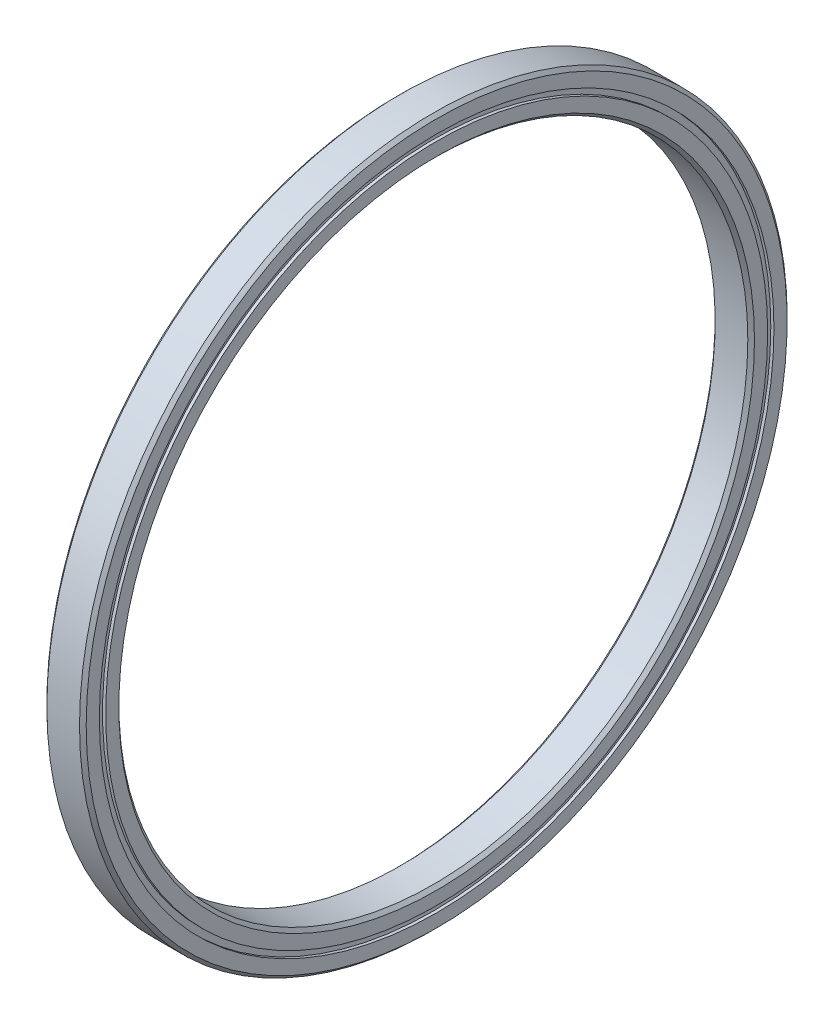
ISO-10303-21;
HEADER;
FILE_DESCRIPTION(('STEP AP214'),'2;1');
FILE_NAME('part.step','',(''),(''),'','','');
FILE_SCHEMA(('AUTOMOTIVE_DESIGN { 1 0 10303 214 1 1 1 1 }'));
ENDSEC;
DATA;
#1=APPLICATION_CONTEXT('core data for automotive mechanical design processes');
#2=APPLICATION_PROTOCOL_DEFINITION('international standard','automotive_design',2000,#1);
#3=PRODUCT_CONTEXT('',#1,'mechanical');
#4=PRODUCT('Part','Part','',(#3));
#5=PRODUCT_RELATED_PRODUCT_CATEGORY('part','',(#4));
#6=PRODUCT_DEFINITION_FORMATION('','',#4);
#7=PRODUCT_DEFINITION_CONTEXT('part definition',#1,'design');
#8=PRODUCT_DEFINITION('design','',#6,#7);
#9=PRODUCT_DEFINITION_SHAPE('','',#8);
#10=(LENGTH_UNIT() NAMED_UNIT(*) SI_UNIT(.MILLI.,.METRE.));
#11=(NAMED_UNIT(*) PLANE_ANGLE_UNIT() SI_UNIT($,.RADIAN.));
#12=(NAMED_UNIT(*) SI_UNIT($,.STERADIAN.) SOLID_ANGLE_UNIT());
#13=UNCERTAINTY_MEASURE_WITH_UNIT(LENGTH_MEASURE(1.E-05),#10,'distance_accuracy_value','');
#14=(GEOMETRIC_REPRESENTATION_CONTEXT(3) GLOBAL_UNCERTAINTY_ASSIGNED_CONTEXT((#13)) GLOBAL_UNIT_ASSIGNED_CONTEXT((#10,
#11,#12)) REPRESENTATION_CONTEXT('',''));
#15=CARTESIAN_POINT('',(0.,0.,0.));
#16=DIRECTION('',(0.,0.,1.));
#17=DIRECTION('',(1.,0.,0.));
#18=AXIS2_PLACEMENT_3D('',#15,#16,#17);
#19=CARTESIAN_POINT('',(-1.31809231637,-53.975,0.));
#20=DIRECTION('',(1.,0.,0.));
#21=DIRECTION('',(0.,0.,-1.));
#22=AXIS2_PLACEMENT_3D('',#19,#20,#21);
#23=CYLINDRICAL_SURFACE('',#22,50.8);
#24=CARTESIAN_POINT('',(-2.63618463276569,-53.975,0.));
#25=DIRECTION('',(-1.,0.,0.));
#26=DIRECTION('',(0.,1.,0.));
#27=AXIS2_PLACEMENT_3D('',#24,#25,#26);
#28=CIRCLE('',#27,50.7999999999943);
#29=CARTESIAN_POINT('',(-2.63618463276569,-3.17500000000569,0.));
#30=VERTEX_POINT('',#29);
#31=EDGE_CURVE('E30',#30,#30,#28,.T.);
#32=ORIENTED_EDGE('',*,*,#31,.T.);
#33=EDGE_LOOP('',(#32));
#34=FACE_BOUND('',#33,.T.);
#35=CARTESIAN_POINT('',(2.6361846327557,-53.975,0.));
#36=DIRECTION('',(1.,0.,0.));
#37=DIRECTION('',(0.,1.,0.));
#38=AXIS2_PLACEMENT_3D('',#35,#36,#37);
#39=CIRCLE('',#38,50.7999999999843);
#40=CARTESIAN_POINT('',(2.63618463275569,-3.17500000001569,0.));
#41=VERTEX_POINT('',#40);
#42=EDGE_CURVE('E33',#41,#41,#39,.T.);
#43=ORIENTED_EDGE('',*,*,#42,.T.);
#44=EDGE_LOOP('',(#43));
#45=FACE_BOUND('',#44,.T.);
#46=ADVANCED_FACE('F15',(#34,#45),#23,.F.);
#47=CARTESIAN_POINT('',(3.17499999938431,-53.975,0.));
#48=DIRECTION('',(1.,0.,0.));
#49=DIRECTION('',(0.,0.,-1.));
#50=AXIS2_PLACEMENT_3D('',#47,#48,#49);
#51=CONICAL_SURFACE('',#50,51.3388153666157,0.785398163399999);
#52=ORIENTED_EDGE('',*,*,#42,.F.);
#53=EDGE_LOOP('',(#52));
#54=FACE_BOUND('',#53,.T.);
#55=CARTESIAN_POINT('',(3.17499999938431,-53.975,0.));
#56=DIRECTION('',(1.,0.,0.));
#57=DIRECTION('',(0.,0.,-1.));
#58=AXIS2_PLACEMENT_3D('',#55,#56,#57);
#59=CIRCLE('',#58,51.3388153666157);
#60=CARTESIAN_POINT('',(3.17499999938431,-53.975,-51.3388153666157));
#61=VERTEX_POINT('',#60);
#62=EDGE_CURVE('E18',#61,#61,#59,.F.);
#63=ORIENTED_EDGE('',*,*,#62,.F.);
#64=EDGE_LOOP('',(#63));
#65=FACE_BOUND('',#64,.T.);
#66=ADVANCED_FACE('F74',(#54,#65),#51,.F.);
#67=CARTESIAN_POINT('',(-3.17499999988432,-53.975,0.));
#68=DIRECTION('',(-1.,0.,0.));
#69=DIRECTION('',(0.,0.,1.));
#70=AXIS2_PLACEMENT_3D('',#67,#68,#69);
#71=CONICAL_SURFACE('',#70,51.3388153671157,0.785398163399999);
#72=CARTESIAN_POINT('',(-3.17499999988433,-53.975,0.));
#73=DIRECTION('',(-1.,0.,0.));
#74=DIRECTION('',(0.,0.,1.));
#75=AXIS2_PLACEMENT_3D('',#72,#73,#74);
#76=CIRCLE('',#75,51.3388153671157);
#77=CARTESIAN_POINT('',(-3.17499999988433,-53.975,51.3388153671157));
#78=VERTEX_POINT('',#77);
#79=EDGE_CURVE('E64',#78,#78,#76,.F.);
#80=ORIENTED_EDGE('',*,*,#79,.F.);
#81=EDGE_LOOP('',(#80));
#82=FACE_BOUND('',#81,.T.);
#83=ORIENTED_EDGE('',*,*,#31,.F.);
#84=EDGE_LOOP('',(#83));
#85=FACE_BOUND('',#84,.T.);
#86=ADVANCED_FACE('F76',(#82,#85),#71,.F.);
#87=CARTESIAN_POINT('',(3.175,-2.63618463274,0.));
#88=DIRECTION('',(1.,0.,0.));
#89=DIRECTION('',(0.,0.,-1.));
#90=AXIS2_PLACEMENT_3D('',#87,#88,#89);
#91=PLANE('',#90);
#92=ORIENTED_EDGE('',*,*,#62,.T.);
#93=EDGE_LOOP('',(#92));
#94=FACE_BOUND('',#93,.T.);
#95=CARTESIAN_POINT('',(3.17500000066,-53.975,0.));
#96=DIRECTION('',(1.,0.,0.));
#97=DIRECTION('',(0.,0.,-1.));
#98=AXIS2_PLACEMENT_3D('',#95,#96,#97);
#99=CIRCLE('',#98,53.467);
#100=CARTESIAN_POINT('',(3.17500000066,-53.975,-53.467));
#101=VERTEX_POINT('',#100);
#102=EDGE_CURVE('E62',#101,#101,#99,.F.);
#103=ORIENTED_EDGE('',*,*,#102,.F.);
#104=EDGE_LOOP('',(#103));
#105=FACE_BOUND('',#104,.T.);
#106=ADVANCED_FACE('F71',(#94,#105),#91,.T.);
#107=CARTESIAN_POINT('',(-3.175,-0.508,0.));
#108=DIRECTION('',(-1.,0.,0.));
#109=DIRECTION('',(0.,0.,1.));
#110=AXIS2_PLACEMENT_3D('',#107,#108,#109);
#111=PLANE('',#110);
#112=ORIENTED_EDGE('',*,*,#79,.T.);
#113=EDGE_LOOP('',(#112));
#114=FACE_BOUND('',#113,.T.);
#115=CARTESIAN_POINT('',(-3.175,-53.975,0.));
#116=DIRECTION('',(1.,0.,0.));
#117=DIRECTION('',(0.,0.,-1.));
#118=AXIS2_PLACEMENT_3D('',#115,#116,#117);
#119=CIRCLE('',#118,53.467);
#120=CARTESIAN_POINT('',(-3.175,-53.975,-53.467));
#121=VERTEX_POINT('',#120);
#122=EDGE_CURVE('E59',#121,#121,#119,.T.);
#123=ORIENTED_EDGE('',*,*,#122,.F.);
#124=EDGE_LOOP('',(#123));
#125=FACE_BOUND('',#124,.T.);
#126=ADVANCED_FACE('F133',(#114,#125),#111,.T.);
#127=CARTESIAN_POINT('',(2.921,-53.975,0.));
#128=DIRECTION('',(1.,0.,0.));
#129=DIRECTION('',(0.,0.,-1.));
#130=AXIS2_PLACEMENT_3D('',#127,#128,#129);
#131=CYLINDRICAL_SURFACE('',#130,53.467);
#132=ORIENTED_EDGE('',*,*,#102,.T.);
#133=EDGE_LOOP('',(#132));
#134=FACE_BOUND('',#133,.T.);
#135=CARTESIAN_POINT('',(2.66699999934,-53.975,0.));
#136=DIRECTION('',(1.,0.,0.));
#137=DIRECTION('',(0.,0.,-1.));
#138=AXIS2_PLACEMENT_3D('',#135,#136,#137);
#139=CIRCLE('',#138,53.467);
#140=CARTESIAN_POINT('',(2.66699999934,-53.975,-53.467));
#141=VERTEX_POINT('',#140);
#142=EDGE_CURVE('E56',#141,#141,#139,.F.);
#143=ORIENTED_EDGE('',*,*,#142,.F.);
#144=EDGE_LOOP('',(#143));
#145=FACE_BOUND('',#144,.T.);
#146=ADVANCED_FACE('F129',(#134,#145),#131,.T.);
#147=CARTESIAN_POINT('',(-2.921,-53.975,0.));
#148=DIRECTION('',(1.,0.,0.));
#149=DIRECTION('',(0.,0.,-1.));
#150=AXIS2_PLACEMENT_3D('',#147,#148,#149);
#151=CYLINDRICAL_SURFACE('',#150,53.467);
#152=CARTESIAN_POINT('',(-2.66699999934,-53.975,0.));
#153=DIRECTION('',(1.,0.,0.));
#154=DIRECTION('',(0.,0.,-1.));
#155=AXIS2_PLACEMENT_3D('',#152,#153,#154);
#156=CIRCLE('',#155,53.467);
#157=CARTESIAN_POINT('',(-2.66699999934,-53.975,-53.467));
#158=VERTEX_POINT('',#157);
#159=EDGE_CURVE('E53',#158,#158,#156,.T.);
#160=ORIENTED_EDGE('',*,*,#159,.F.);
#161=EDGE_LOOP('',(#160));
#162=FACE_BOUND('',#161,.T.);
#163=ORIENTED_EDGE('',*,*,#122,.T.);
#164=EDGE_LOOP('',(#163));
#165=FACE_BOUND('',#164,.T.);
#166=ADVANCED_FACE('F125',(#162,#165),#151,.T.);
#167=CARTESIAN_POINT('',(2.667,0.,0.));
#168=DIRECTION('',(1.,0.,0.));
#169=DIRECTION('',(0.,0.,-1.));
#170=AXIS2_PLACEMENT_3D('',#167,#168,#169);
#171=PLANE('',#170);
#172=ORIENTED_EDGE('',*,*,#142,.T.);
#173=EDGE_LOOP('',(#172));
#174=FACE_BOUND('',#173,.T.);
#175=CARTESIAN_POINT('',(2.66699999934,-53.975,0.));
#176=DIRECTION('',(1.,0.,0.));
#177=DIRECTION('',(0.,0.,-1.));
#178=AXIS2_PLACEMENT_3D('',#175,#176,#177);
#179=CIRCLE('',#178,54.483);
#180=CARTESIAN_POINT('',(2.66699999934,-53.975,-54.483));
#181=VERTEX_POINT('',#180);
#182=EDGE_CURVE('E50',#181,#181,#179,.T.);
#183=ORIENTED_EDGE('',*,*,#182,.T.);
#184=EDGE_LOOP('',(#183));
#185=FACE_BOUND('',#184,.T.);
#186=ADVANCED_FACE('F121',(#174,#185),#171,.T.);
#187=CARTESIAN_POINT('',(-2.667,0.508,0.));
#188=DIRECTION('',(-1.,0.,0.));
#189=DIRECTION('',(0.,0.,1.));
#190=AXIS2_PLACEMENT_3D('',#187,#188,#189);
#191=PLANE('',#190);
#192=ORIENTED_EDGE('',*,*,#159,.T.);
#193=EDGE_LOOP('',(#192));
#194=FACE_BOUND('',#193,.T.);
#195=CARTESIAN_POINT('',(-2.66699999934,-53.975,0.));
#196=DIRECTION('',(1.,0.,0.));
#197=DIRECTION('',(0.,0.,-1.));
#198=AXIS2_PLACEMENT_3D('',#195,#196,#197);
#199=CIRCLE('',#198,54.483);
#200=CARTESIAN_POINT('',(-2.66699999934,-53.975,-54.483));
#201=VERTEX_POINT('',#200);
#202=EDGE_CURVE('E47',#201,#201,#199,.F.);
#203=ORIENTED_EDGE('',*,*,#202,.T.);
#204=EDGE_LOOP('',(#203));
#205=FACE_BOUND('',#204,.T.);
#206=ADVANCED_FACE('F117',(#194,#205),#191,.T.);
#207=CARTESIAN_POINT('',(2.921,-53.975,0.));
#208=DIRECTION('',(1.,0.,0.));
#209=DIRECTION('',(0.,0.,-1.));
#210=AXIS2_PLACEMENT_3D('',#207,#208,#209);
#211=CYLINDRICAL_SURFACE('',#210,54.483);
#212=ORIENTED_EDGE('',*,*,#182,.F.);
#213=EDGE_LOOP('',(#212));
#214=FACE_BOUND('',#213,.T.);
#215=CARTESIAN_POINT('',(3.175,-53.975,0.));
#216=DIRECTION('',(1.,0.,0.));
#217=DIRECTION('',(0.,0.,-1.));
#218=AXIS2_PLACEMENT_3D('',#215,#216,#217);
#219=CIRCLE('',#218,54.483);
#220=CARTESIAN_POINT('',(3.175,-53.975,-54.483));
#221=VERTEX_POINT('',#220);
#222=EDGE_CURVE('E44',#221,#221,#219,.F.);
#223=ORIENTED_EDGE('',*,*,#222,.F.);
#224=EDGE_LOOP('',(#223));
#225=FACE_BOUND('',#224,.T.);
#226=ADVANCED_FACE('F113',(#214,#225),#211,.F.);
#227=CARTESIAN_POINT('',(-2.921,-53.975,0.));
#228=DIRECTION('',(1.,0.,0.));
#229=DIRECTION('',(0.,0.,-1.));
#230=AXIS2_PLACEMENT_3D('',#227,#228,#229);
#231=CYLINDRICAL_SURFACE('',#230,54.483);
#232=CARTESIAN_POINT('',(-3.17500000066,-53.975,0.));
#233=DIRECTION('',(1.,0.,0.));
#234=DIRECTION('',(0.,0.,-1.));
#235=AXIS2_PLACEMENT_3D('',#232,#233,#234);
#236=CIRCLE('',#235,54.483);
#237=CARTESIAN_POINT('',(-3.17500000066,-53.975,-54.483));
#238=VERTEX_POINT('',#237);
#239=EDGE_CURVE('E41',#238,#238,#236,.T.);
#240=ORIENTED_EDGE('',*,*,#239,.F.);
#241=EDGE_LOOP('',(#240));
#242=FACE_BOUND('',#241,.T.);
#243=ORIENTED_EDGE('',*,*,#202,.F.);
#244=EDGE_LOOP('',(#243));
#245=FACE_BOUND('',#244,.T.);
#246=ADVANCED_FACE('F109',(#242,#245),#231,.F.);
#247=CARTESIAN_POINT('',(3.175,0.508,0.));
#248=DIRECTION('',(1.,0.,0.));
#249=DIRECTION('',(0.,0.,-1.));
#250=AXIS2_PLACEMENT_3D('',#247,#248,#249);
#251=PLANE('',#250);
#252=ORIENTED_EDGE('',*,*,#222,.T.);
#253=EDGE_LOOP('',(#252));
#254=FACE_BOUND('',#253,.T.);
#255=CARTESIAN_POINT('',(3.17499999988431,-53.975,0.));
#256=DIRECTION('',(-1.,0.,0.));
#257=DIRECTION('',(0.,0.,1.));
#258=AXIS2_PLACEMENT_3D('',#255,#256,#257);
#259=CIRCLE('',#258,56.6111846328843);
#260=CARTESIAN_POINT('',(3.17499999988431,-53.975,56.6111846328843));
#261=VERTEX_POINT('',#260);
#262=EDGE_CURVE('E38',#261,#261,#259,.T.);
#263=ORIENTED_EDGE('',*,*,#262,.F.);
#264=EDGE_LOOP('',(#263));
#265=FACE_BOUND('',#264,.T.);
#266=ADVANCED_FACE('F105',(#254,#265),#251,.T.);
#267=CARTESIAN_POINT('',(-3.175,2.63618463274,0.));
#268=DIRECTION('',(-1.,0.,0.));
#269=DIRECTION('',(0.,0.,1.));
#270=AXIS2_PLACEMENT_3D('',#267,#268,#269);
#271=PLANE('',#270);
#272=ORIENTED_EDGE('',*,*,#239,.T.);
#273=EDGE_LOOP('',(#272));
#274=FACE_BOUND('',#273,.T.);
#275=CARTESIAN_POINT('',(-3.17500000001431,-53.975,0.));
#276=DIRECTION('',(1.,0.,0.));
#277=DIRECTION('',(0.,0.,-1.));
#278=AXIS2_PLACEMENT_3D('',#275,#276,#277);
#279=CIRCLE('',#278,56.6111846327543);
#280=CARTESIAN_POINT('',(-3.17500000001431,-53.975,-56.6111846327543));
#281=VERTEX_POINT('',#280);
#282=EDGE_CURVE('E27',#281,#281,#279,.T.);
#283=ORIENTED_EDGE('',*,*,#282,.F.);
#284=EDGE_LOOP('',(#283));
#285=FACE_BOUND('',#284,.T.);
#286=ADVANCED_FACE('F101',(#274,#285),#271,.T.);
#287=CARTESIAN_POINT('',(2.63618463276568,-53.975,0.));
#288=DIRECTION('',(-1.,0.,0.));
#289=DIRECTION('',(0.,0.,1.));
#290=AXIS2_PLACEMENT_3D('',#287,#288,#289);
#291=CONICAL_SURFACE('',#290,57.1500000000057,0.785398163400003);
#292=ORIENTED_EDGE('',*,*,#262,.T.);
#293=EDGE_LOOP('',(#292));
#294=FACE_BOUND('',#293,.T.);
#295=CARTESIAN_POINT('',(2.63618463276,-53.975,0.));
#296=DIRECTION('',(1.,0.,0.));
#297=DIRECTION('',(0.,0.,-1.));
#298=AXIS2_PLACEMENT_3D('',#295,#296,#297);
#299=CIRCLE('',#298,57.15);
#300=CARTESIAN_POINT('',(2.63618463276,-53.975,-57.15));
#301=VERTEX_POINT('',#300);
#302=EDGE_CURVE('E22',#301,#301,#299,.F.);
#303=ORIENTED_EDGE('',*,*,#302,.F.);
#304=EDGE_LOOP('',(#303));
#305=FACE_BOUND('',#304,.T.);
#306=ADVANCED_FACE('F95',(#294,#305),#291,.T.);
#307=CARTESIAN_POINT('',(-2.63618463275568,-53.975,0.));
#308=DIRECTION('',(1.,0.,0.));
#309=DIRECTION('',(0.,0.,-1.));
#310=AXIS2_PLACEMENT_3D('',#307,#308,#309);
#311=CONICAL_SURFACE('',#310,57.1500000000157,0.785398163399999);
#312=CARTESIAN_POINT('',(-2.63618463274,-53.975,0.));
#313=DIRECTION('',(1.,0.,0.));
#314=DIRECTION('',(0.,0.,-1.));
#315=AXIS2_PLACEMENT_3D('',#312,#313,#314);
#316=CIRCLE('',#315,57.15);
#317=CARTESIAN_POINT('',(-2.63618463274,-53.975,-57.15));
#318=VERTEX_POINT('',#317);
#319=EDGE_CURVE('E10',#318,#318,#316,.T.);
#320=ORIENTED_EDGE('',*,*,#319,.F.);
#321=EDGE_LOOP('',(#320));
#322=FACE_BOUND('',#321,.T.);
#323=ORIENTED_EDGE('',*,*,#282,.T.);
#324=EDGE_LOOP('',(#323));
#325=FACE_BOUND('',#324,.T.);
#326=ADVANCED_FACE('F89',(#322,#325),#311,.T.);
#327=CARTESIAN_POINT('',(1.31809231637,-53.975,0.));
#328=DIRECTION('',(1.,0.,0.));
#329=DIRECTION('',(0.,0.,-1.));
#330=AXIS2_PLACEMENT_3D('',#327,#328,#329);
#331=CYLINDRICAL_SURFACE('',#330,57.15);
#332=ORIENTED_EDGE('',*,*,#302,.T.);
#333=EDGE_LOOP('',(#332));
#334=FACE_BOUND('',#333,.T.);
#335=ORIENTED_EDGE('',*,*,#319,.T.);
#336=EDGE_LOOP('',(#335));
#337=FACE_BOUND('',#336,.T.);
#338=ADVANCED_FACE('F87',(#334,#337),#331,.T.);
#339=CLOSED_SHELL('',(#46,#66,#86,#106,#126,#146,#166,#186,#206,#226,#246,#266,#286,#306,#326,#338));
#340=MANIFOLD_SOLID_BREP('B1',#339);
#341=ADVANCED_BREP_SHAPE_REPRESENTATION('',(#18,#340),#14);
#342=SHAPE_DEFINITION_REPRESENTATION(#9,#341);
ENDSEC;
END-ISO-10303-21;
